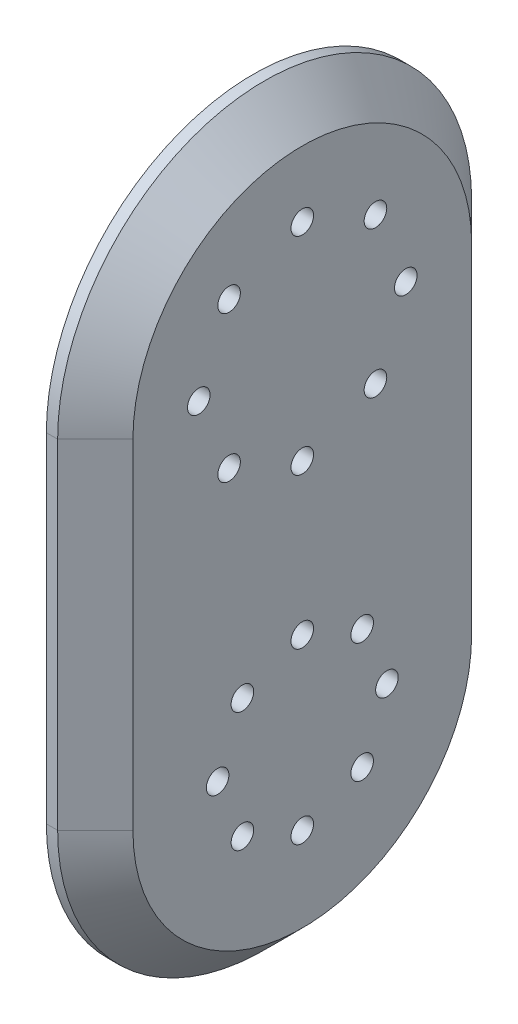
ISO-10303-21;
HEADER;
FILE_DESCRIPTION(('STEP AP214'),'2;1');
FILE_NAME('part.step','',(''),(''),'','','');
FILE_SCHEMA(('AUTOMOTIVE_DESIGN { 1 0 10303 214 1 1 1 1 }'));
ENDSEC;
DATA;
#1=APPLICATION_CONTEXT('core data for automotive mechanical design processes');
#2=APPLICATION_PROTOCOL_DEFINITION('international standard','automotive_design',2000,#1);
#3=PRODUCT_CONTEXT('',#1,'mechanical');
#4=PRODUCT('Part','Part','',(#3));
#5=PRODUCT_RELATED_PRODUCT_CATEGORY('part','',(#4));
#6=PRODUCT_DEFINITION_FORMATION('','',#4);
#7=PRODUCT_DEFINITION_CONTEXT('part definition',#1,'design');
#8=PRODUCT_DEFINITION('design','',#6,#7);
#9=PRODUCT_DEFINITION_SHAPE('','',#8);
#10=(LENGTH_UNIT() NAMED_UNIT(*) SI_UNIT(.MILLI.,.METRE.));
#11=(NAMED_UNIT(*) PLANE_ANGLE_UNIT() SI_UNIT($,.RADIAN.));
#12=(NAMED_UNIT(*) SI_UNIT($,.STERADIAN.) SOLID_ANGLE_UNIT());
#13=UNCERTAINTY_MEASURE_WITH_UNIT(LENGTH_MEASURE(1.E-05),#10,'distance_accuracy_value','');
#14=(GEOMETRIC_REPRESENTATION_CONTEXT(3) GLOBAL_UNCERTAINTY_ASSIGNED_CONTEXT((#13)) GLOBAL_UNIT_ASSIGNED_CONTEXT((#10,
#11,#12)) REPRESENTATION_CONTEXT('',''));
#15=CARTESIAN_POINT('',(0.,0.,0.));
#16=DIRECTION('',(0.,0.,1.));
#17=DIRECTION('',(1.,0.,0.));
#18=AXIS2_PLACEMENT_3D('',#15,#16,#17);
#19=CARTESIAN_POINT('',(13.,-45.,0.));
#20=DIRECTION('',(-1.,0.,0.));
#21=DIRECTION('',(0.,0.,1.));
#22=AXIS2_PLACEMENT_3D('',#19,#20,#21);
#23=CYLINDRICAL_SURFACE('',#22,55.);
#24=DIRECTION('',(-1.,0.,0.));
#25=VECTOR('',#24,1.);
#26=CARTESIAN_POINT('',(13.,-45.,-55.));
#27=LINE('',#26,#25);
#28=CARTESIAN_POINT('',(3.0000000000001,-45.,-55.));
#29=VERTEX_POINT('',#28);
#30=CARTESIAN_POINT('',(0.,-45.,-55.));
#31=VERTEX_POINT('',#30);
#32=EDGE_CURVE('E258',#29,#31,#27,.T.);
#33=ORIENTED_EDGE('',*,*,#32,.F.);
#34=CARTESIAN_POINT('',(3.00000000000009,-45.,0.));
#35=DIRECTION('',(1.,0.,0.));
#36=DIRECTION('',(0.,0.,-1.));
#37=AXIS2_PLACEMENT_3D('',#34,#35,#36);
#38=CIRCLE('',#37,55.);
#39=CARTESIAN_POINT('',(3.0000000000001,-45.,55.));
#40=VERTEX_POINT('',#39);
#41=EDGE_CURVE('E11',#29,#40,#38,.F.);
#42=ORIENTED_EDGE('',*,*,#41,.T.);
#43=DIRECTION('',(-1.,0.,0.));
#44=VECTOR('',#43,1.);
#45=CARTESIAN_POINT('',(13.,-45.,55.));
#46=LINE('',#45,#44);
#47=CARTESIAN_POINT('',(0.,-45.,55.));
#48=VERTEX_POINT('',#47);
#49=EDGE_CURVE('E252',#40,#48,#46,.T.);
#50=ORIENTED_EDGE('',*,*,#49,.T.);
#51=CARTESIAN_POINT('',(0.,-45.,0.));
#52=DIRECTION('',(1.,0.,0.));
#53=DIRECTION('',(0.,0.,-1.));
#54=AXIS2_PLACEMENT_3D('',#51,#52,#53);
#55=CIRCLE('',#54,55.);
#56=EDGE_CURVE('E240',#48,#31,#55,.T.);
#57=ORIENTED_EDGE('',*,*,#56,.T.);
#58=EDGE_LOOP('',(#33,#42,#50,#57));
#59=FACE_BOUND('',#58,.T.);
#60=ADVANCED_FACE('F37',(#59),#23,.T.);
#61=CARTESIAN_POINT('',(13.,-45.,-55.));
#62=DIRECTION('',(0.,0.,1.));
#63=DIRECTION('',(0.,-1.,0.));
#64=AXIS2_PLACEMENT_3D('',#61,#62,#63);
#65=PLANE('',#64);
#66=DIRECTION('',(-1.,0.,0.));
#67=VECTOR('',#66,1.);
#68=CARTESIAN_POINT('',(13.,45.,-55.));
#69=LINE('',#68,#67);
#70=CARTESIAN_POINT('',(3.0000000000001,45.,-55.));
#71=VERTEX_POINT('',#70);
#72=CARTESIAN_POINT('',(0.,45.,-55.));
#73=VERTEX_POINT('',#72);
#74=EDGE_CURVE('E256',#71,#73,#69,.T.);
#75=ORIENTED_EDGE('',*,*,#74,.F.);
#76=DIRECTION('',(0.,-1.,0.));
#77=VECTOR('',#76,1.);
#78=CARTESIAN_POINT('',(3.00000000000009,-45.,-55.));
#79=LINE('',#78,#77);
#80=EDGE_CURVE('E47',#71,#29,#79,.T.);
#81=ORIENTED_EDGE('',*,*,#80,.T.);
#82=ORIENTED_EDGE('',*,*,#32,.T.);
#83=DIRECTION('',(0.,1.,0.));
#84=VECTOR('',#83,1.);
#85=CARTESIAN_POINT('',(0.,-45.,-55.));
#86=LINE('',#85,#84);
#87=EDGE_CURVE('E243',#31,#73,#86,.T.);
#88=ORIENTED_EDGE('',*,*,#87,.T.);
#89=EDGE_LOOP('',(#75,#81,#82,#88));
#90=FACE_BOUND('',#89,.T.);
#91=ADVANCED_FACE('F303',(#90),#65,.F.);
#92=CARTESIAN_POINT('',(13.,45.,0.));
#93=DIRECTION('',(-1.,0.,0.));
#94=DIRECTION('',(0.,0.,1.));
#95=AXIS2_PLACEMENT_3D('',#92,#93,#94);
#96=CYLINDRICAL_SURFACE('',#95,55.);
#97=DIRECTION('',(-1.,0.,0.));
#98=VECTOR('',#97,1.);
#99=CARTESIAN_POINT('',(13.,45.,55.));
#100=LINE('',#99,#98);
#101=CARTESIAN_POINT('',(3.0000000000001,45.,55.));
#102=VERTEX_POINT('',#101);
#103=CARTESIAN_POINT('',(0.,45.,55.));
#104=VERTEX_POINT('',#103);
#105=EDGE_CURVE('E254',#102,#104,#100,.T.);
#106=ORIENTED_EDGE('',*,*,#105,.F.);
#107=CARTESIAN_POINT('',(3.00000000000009,45.,0.));
#108=DIRECTION('',(1.,0.,0.));
#109=DIRECTION('',(0.,0.,-1.));
#110=AXIS2_PLACEMENT_3D('',#107,#108,#109);
#111=CIRCLE('',#110,55.);
#112=EDGE_CURVE('E269',#102,#71,#111,.F.);
#113=ORIENTED_EDGE('',*,*,#112,.T.);
#114=ORIENTED_EDGE('',*,*,#74,.T.);
#115=CARTESIAN_POINT('',(0.,45.,0.));
#116=DIRECTION('',(1.,0.,0.));
#117=DIRECTION('',(0.,0.,-1.));
#118=AXIS2_PLACEMENT_3D('',#115,#116,#117);
#119=CIRCLE('',#118,55.);
#120=EDGE_CURVE('E246',#73,#104,#119,.T.);
#121=ORIENTED_EDGE('',*,*,#120,.T.);
#122=EDGE_LOOP('',(#106,#113,#114,#121));
#123=FACE_BOUND('',#122,.T.);
#124=ADVANCED_FACE('F305',(#123),#96,.T.);
#125=CARTESIAN_POINT('',(13.,-45.,55.));
#126=DIRECTION('',(0.,0.,-1.));
#127=DIRECTION('',(0.,1.,0.));
#128=AXIS2_PLACEMENT_3D('',#125,#126,#127);
#129=PLANE('',#128);
#130=ORIENTED_EDGE('',*,*,#49,.F.);
#131=DIRECTION('',(0.,1.,0.));
#132=VECTOR('',#131,1.);
#133=CARTESIAN_POINT('',(3.00000000000009,45.,55.));
#134=LINE('',#133,#132);
#135=EDGE_CURVE('E272',#40,#102,#134,.T.);
#136=ORIENTED_EDGE('',*,*,#135,.T.);
#137=ORIENTED_EDGE('',*,*,#105,.T.);
#138=DIRECTION('',(0.,-1.,0.));
#139=VECTOR('',#138,1.);
#140=CARTESIAN_POINT('',(0.,-45.,55.));
#141=LINE('',#140,#139);
#142=EDGE_CURVE('E249',#104,#48,#141,.T.);
#143=ORIENTED_EDGE('',*,*,#142,.T.);
#144=EDGE_LOOP('',(#130,#136,#137,#143));
#145=FACE_BOUND('',#144,.T.);
#146=ADVANCED_FACE('F295',(#145),#129,.F.);
#147=CARTESIAN_POINT('',(13.,-45.,0.));
#148=DIRECTION('',(1.,0.,0.));
#149=DIRECTION('',(0.,0.,-1.));
#150=AXIS2_PLACEMENT_3D('',#147,#148,#149);
#151=PLANE('',#150);
#152=CARTESIAN_POINT('',(13.,-22.5,0.));
#153=DIRECTION('',(1.,0.,0.));
#154=DIRECTION('',(0.,0.,-1.));
#155=AXIS2_PLACEMENT_3D('',#152,#153,#154);
#156=CIRCLE('',#155,3.);
#157=CARTESIAN_POINT('',(13.,-22.5,-3.));
#158=VERTEX_POINT('',#157);
#159=EDGE_CURVE('E155',#158,#158,#156,.T.);
#160=ORIENTED_EDGE('',*,*,#159,.F.);
#161=EDGE_LOOP('',(#160));
#162=FACE_BOUND('',#161,.T.);
#163=CARTESIAN_POINT('',(13.,-29.0900974233027,15.9099025766973));
#164=DIRECTION('',(1.,0.,0.));
#165=DIRECTION('',(0.,0.,-1.));
#166=AXIS2_PLACEMENT_3D('',#163,#164,#165);
#167=CIRCLE('',#166,3.);
#168=CARTESIAN_POINT('',(13.,-29.0900974233027,12.9099025766973));
#169=VERTEX_POINT('',#168);
#170=EDGE_CURVE('E718',#169,#169,#167,.T.);
#171=ORIENTED_EDGE('',*,*,#170,.F.);
#172=EDGE_LOOP('',(#171));
#173=FACE_BOUND('',#172,.T.);
#174=CARTESIAN_POINT('',(13.,-45.,22.5));
#175=DIRECTION('',(1.,0.,0.));
#176=DIRECTION('',(0.,0.,-1.));
#177=AXIS2_PLACEMENT_3D('',#174,#175,#176);
#178=CIRCLE('',#177,2.99999999999999);
#179=CARTESIAN_POINT('',(13.,-45.,19.5));
#180=VERTEX_POINT('',#179);
#181=EDGE_CURVE('E716',#180,#180,#178,.T.);
#182=ORIENTED_EDGE('',*,*,#181,.F.);
#183=EDGE_LOOP('',(#182));
#184=FACE_BOUND('',#183,.T.);
#185=CARTESIAN_POINT('',(13.,-60.9099025766973,15.9099025766973));
#186=DIRECTION('',(1.,0.,0.));
#187=DIRECTION('',(0.,0.,-1.));
#188=AXIS2_PLACEMENT_3D('',#185,#186,#187);
#189=CIRCLE('',#188,2.99999999999999);
#190=CARTESIAN_POINT('',(13.,-60.9099025766973,12.9099025766973));
#191=VERTEX_POINT('',#190);
#192=EDGE_CURVE('E713',#191,#191,#189,.T.);
#193=ORIENTED_EDGE('',*,*,#192,.F.);
#194=EDGE_LOOP('',(#193));
#195=FACE_BOUND('',#194,.T.);
#196=CARTESIAN_POINT('',(13.,-67.5,0.));
#197=DIRECTION('',(1.,0.,0.));
#198=DIRECTION('',(0.,0.,-1.));
#199=AXIS2_PLACEMENT_3D('',#196,#197,#198);
#200=CIRCLE('',#199,3.);
#201=CARTESIAN_POINT('',(13.,-67.5,-3.));
#202=VERTEX_POINT('',#201);
#203=EDGE_CURVE('E710',#202,#202,#200,.T.);
#204=ORIENTED_EDGE('',*,*,#203,.F.);
#205=EDGE_LOOP('',(#204));
#206=FACE_BOUND('',#205,.T.);
#207=CARTESIAN_POINT('',(13.,-60.9099025766973,-15.9099025766973));
#208=DIRECTION('',(1.,0.,0.));
#209=DIRECTION('',(0.,0.,-1.));
#210=AXIS2_PLACEMENT_3D('',#207,#208,#209);
#211=CIRCLE('',#210,3.);
#212=CARTESIAN_POINT('',(13.,-60.9099025766973,-18.9099025766973));
#213=VERTEX_POINT('',#212);
#214=EDGE_CURVE('E707',#213,#213,#211,.T.);
#215=ORIENTED_EDGE('',*,*,#214,.F.);
#216=EDGE_LOOP('',(#215));
#217=FACE_BOUND('',#216,.T.);
#218=CARTESIAN_POINT('',(13.,-45.,-22.5));
#219=DIRECTION('',(1.,0.,0.));
#220=DIRECTION('',(0.,0.,-1.));
#221=AXIS2_PLACEMENT_3D('',#218,#219,#220);
#222=CIRCLE('',#221,3.);
#223=CARTESIAN_POINT('',(13.,-45.,-25.5));
#224=VERTEX_POINT('',#223);
#225=EDGE_CURVE('E682',#224,#224,#222,.T.);
#226=ORIENTED_EDGE('',*,*,#225,.F.);
#227=EDGE_LOOP('',(#226));
#228=FACE_BOUND('',#227,.T.);
#229=CARTESIAN_POINT('',(13.,-29.0900974233027,-15.9099025766973));
#230=DIRECTION('',(1.,0.,0.));
#231=DIRECTION('',(0.,0.,-1.));
#232=AXIS2_PLACEMENT_3D('',#229,#230,#231);
#233=CIRCLE('',#232,3.);
#234=CARTESIAN_POINT('',(13.,-29.0900974233027,-18.9099025766973));
#235=VERTEX_POINT('',#234);
#236=EDGE_CURVE('E678',#235,#235,#233,.T.);
#237=ORIENTED_EDGE('',*,*,#236,.F.);
#238=EDGE_LOOP('',(#237));
#239=FACE_BOUND('',#238,.T.);
#240=CARTESIAN_POINT('',(13.,72.5,0.));
#241=DIRECTION('',(1.,0.,0.));
#242=DIRECTION('',(0.,0.,-1.));
#243=AXIS2_PLACEMENT_3D('',#240,#241,#242);
#244=CIRCLE('',#243,3.);
#245=CARTESIAN_POINT('',(13.,72.5,-3.));
#246=VERTEX_POINT('',#245);
#247=EDGE_CURVE('E190',#246,#246,#244,.F.);
#248=ORIENTED_EDGE('',*,*,#247,.T.);
#249=EDGE_LOOP('',(#248));
#250=FACE_BOUND('',#249,.T.);
#251=CARTESIAN_POINT('',(13.,64.4454364826301,19.44543648263));
#252=DIRECTION('',(1.,0.,0.));
#253=DIRECTION('',(0.,0.,-1.));
#254=AXIS2_PLACEMENT_3D('',#251,#252,#253);
#255=CIRCLE('',#254,3.00000000000001);
#256=CARTESIAN_POINT('',(13.,64.4454364826301,16.44543648263));
#257=VERTEX_POINT('',#256);
#258=EDGE_CURVE('E196',#257,#257,#255,.F.);
#259=ORIENTED_EDGE('',*,*,#258,.T.);
#260=EDGE_LOOP('',(#259));
#261=FACE_BOUND('',#260,.T.);
#262=CARTESIAN_POINT('',(13.,45.,27.5));
#263=DIRECTION('',(1.,0.,0.));
#264=DIRECTION('',(0.,0.,-1.));
#265=AXIS2_PLACEMENT_3D('',#262,#263,#264);
#266=CIRCLE('',#265,3.);
#267=CARTESIAN_POINT('',(13.,45.,24.5));
#268=VERTEX_POINT('',#267);
#269=EDGE_CURVE('E202',#268,#268,#266,.F.);
#270=ORIENTED_EDGE('',*,*,#269,.T.);
#271=EDGE_LOOP('',(#270));
#272=FACE_BOUND('',#271,.T.);
#273=CARTESIAN_POINT('',(13.,25.55456351737,19.4454364826301));
#274=DIRECTION('',(1.,0.,0.));
#275=DIRECTION('',(0.,0.,-1.));
#276=AXIS2_PLACEMENT_3D('',#273,#274,#275);
#277=CIRCLE('',#276,3.00000000000001);
#278=CARTESIAN_POINT('',(13.,25.55456351737,16.4454364826301));
#279=VERTEX_POINT('',#278);
#280=EDGE_CURVE('E208',#279,#279,#277,.F.);
#281=ORIENTED_EDGE('',*,*,#280,.T.);
#282=EDGE_LOOP('',(#281));
#283=FACE_BOUND('',#282,.T.);
#284=CARTESIAN_POINT('',(13.,17.5,0.));
#285=DIRECTION('',(1.,0.,0.));
#286=DIRECTION('',(0.,0.,-1.));
#287=AXIS2_PLACEMENT_3D('',#284,#285,#286);
#288=CIRCLE('',#287,3.);
#289=CARTESIAN_POINT('',(13.,17.5,-2.99999999999997));
#290=VERTEX_POINT('',#289);
#291=EDGE_CURVE('E214',#290,#290,#288,.F.);
#292=ORIENTED_EDGE('',*,*,#291,.T.);
#293=EDGE_LOOP('',(#292));
#294=FACE_BOUND('',#293,.T.);
#295=CARTESIAN_POINT('',(13.,25.5545635173699,-19.44543648263));
#296=DIRECTION('',(1.,0.,0.));
#297=DIRECTION('',(0.,0.,-1.));
#298=AXIS2_PLACEMENT_3D('',#295,#296,#297);
#299=CIRCLE('',#298,3.00000000000001);
#300=CARTESIAN_POINT('',(13.,25.5545635173699,-22.44543648263));
#301=VERTEX_POINT('',#300);
#302=EDGE_CURVE('E220',#301,#301,#299,.F.);
#303=ORIENTED_EDGE('',*,*,#302,.T.);
#304=EDGE_LOOP('',(#303));
#305=FACE_BOUND('',#304,.T.);
#306=CARTESIAN_POINT('',(13.,45.,-27.5));
#307=DIRECTION('',(1.,0.,0.));
#308=DIRECTION('',(0.,0.,-1.));
#309=AXIS2_PLACEMENT_3D('',#306,#307,#308);
#310=CIRCLE('',#309,3.);
#311=CARTESIAN_POINT('',(13.,45.,-30.5));
#312=VERTEX_POINT('',#311);
#313=EDGE_CURVE('E226',#312,#312,#310,.F.);
#314=ORIENTED_EDGE('',*,*,#313,.T.);
#315=EDGE_LOOP('',(#314));
#316=FACE_BOUND('',#315,.T.);
#317=CARTESIAN_POINT('',(13.,64.44543648263,-19.4454364826301));
#318=DIRECTION('',(1.,0.,0.));
#319=DIRECTION('',(0.,0.,-1.));
#320=AXIS2_PLACEMENT_3D('',#317,#318,#319);
#321=CIRCLE('',#320,3.);
#322=CARTESIAN_POINT('',(13.,64.44543648263,-22.4454364826301));
#323=VERTEX_POINT('',#322);
#324=EDGE_CURVE('E178',#323,#323,#321,.F.);
#325=ORIENTED_EDGE('',*,*,#324,.T.);
#326=EDGE_LOOP('',(#325));
#327=FACE_BOUND('',#326,.T.);
#328=DIRECTION('',(0.,1.,0.));
#329=VECTOR('',#328,1.);
#330=CARTESIAN_POINT('',(13.,45.,-45.0000000000001));
#331=LINE('',#330,#329);
#332=CARTESIAN_POINT('',(13.,-45.,-45.0000000000001));
#333=VERTEX_POINT('',#332);
#334=CARTESIAN_POINT('',(13.,45.,-45.0000000000001));
#335=VERTEX_POINT('',#334);
#336=EDGE_CURVE('E262',#333,#335,#331,.T.);
#337=ORIENTED_EDGE('',*,*,#336,.T.);
#338=CARTESIAN_POINT('',(13.,45.,0.));
#339=DIRECTION('',(1.,0.,0.));
#340=DIRECTION('',(0.,0.,-1.));
#341=AXIS2_PLACEMENT_3D('',#338,#339,#340);
#342=CIRCLE('',#341,45.0000000000001);
#343=CARTESIAN_POINT('',(13.,45.,45.0000000000002));
#344=VERTEX_POINT('',#343);
#345=EDGE_CURVE('E266',#335,#344,#342,.T.);
#346=ORIENTED_EDGE('',*,*,#345,.T.);
#347=DIRECTION('',(0.,-1.,0.));
#348=VECTOR('',#347,1.);
#349=CARTESIAN_POINT('',(13.,-45.,45.0000000000001));
#350=LINE('',#349,#348);
#351=CARTESIAN_POINT('',(13.,-45.,45.0000000000001));
#352=VERTEX_POINT('',#351);
#353=EDGE_CURVE('E264',#344,#352,#350,.T.);
#354=ORIENTED_EDGE('',*,*,#353,.T.);
#355=CARTESIAN_POINT('',(13.,-45.,0.));
#356=DIRECTION('',(1.,0.,0.));
#357=DIRECTION('',(0.,0.,-1.));
#358=AXIS2_PLACEMENT_3D('',#355,#356,#357);
#359=CIRCLE('',#358,45.0000000000001);
#360=EDGE_CURVE('E260',#352,#333,#359,.T.);
#361=ORIENTED_EDGE('',*,*,#360,.T.);
#362=EDGE_LOOP('',(#337,#346,#354,#361));
#363=FACE_BOUND('',#362,.T.);
#364=ADVANCED_FACE('F313',(#162,#173,#184,#195,#206,#217,#228,#239,#250,#261,#272,#283,#294,
#305,#316,#327,#363),#151,.T.);
#365=CARTESIAN_POINT('',(0.,-45.,0.));
#366=DIRECTION('',(1.,0.,0.));
#367=DIRECTION('',(0.,0.,-1.));
#368=AXIS2_PLACEMENT_3D('',#365,#366,#367);
#369=PLANE('',#368);
#370=DIRECTION('',(0.,0.,-1.));
#371=VECTOR('',#370,1.);
#372=CARTESIAN_POINT('',(0.,-4.99999999999999,-20.9999999999999));
#373=LINE('',#372,#371);
#374=CARTESIAN_POINT('',(0.,-4.99999999999999,20.9999999999999));
#375=VERTEX_POINT('',#374);
#376=CARTESIAN_POINT('',(0.,-4.99999999999999,-20.9999999999999));
#377=VERTEX_POINT('',#376);
#378=EDGE_CURVE('E166',#375,#377,#373,.T.);
#379=ORIENTED_EDGE('',*,*,#378,.F.);
#380=CARTESIAN_POINT('',(0.,-15.,21.));
#381=DIRECTION('',(-1.,0.,0.));
#382=DIRECTION('',(0.,0.,-1.));
#383=AXIS2_PLACEMENT_3D('',#380,#381,#382);
#384=CIRCLE('',#383,10.);
#385=CARTESIAN_POINT('',(0.,-15.0000000000001,31.));
#386=VERTEX_POINT('',#385);
#387=EDGE_CURVE('E55',#386,#375,#384,.T.);
#388=ORIENTED_EDGE('',*,*,#387,.F.);
#389=DIRECTION('',(0.,1.,0.));
#390=VECTOR('',#389,1.);
#391=CARTESIAN_POINT('',(0.,-15.0000000000001,31.));
#392=LINE('',#391,#390);
#393=CARTESIAN_POINT('',(0.,-45.,31.));
#394=VERTEX_POINT('',#393);
#395=EDGE_CURVE('E149',#394,#386,#392,.T.);
#396=ORIENTED_EDGE('',*,*,#395,.F.);
#397=CARTESIAN_POINT('',(0.,-45.,0.));
#398=DIRECTION('',(-1.,0.,0.));
#399=DIRECTION('',(0.,0.,1.));
#400=AXIS2_PLACEMENT_3D('',#397,#398,#399);
#401=CIRCLE('',#400,31.);
#402=CARTESIAN_POINT('',(0.,-45.,-31.));
#403=VERTEX_POINT('',#402);
#404=EDGE_CURVE('E152',#403,#394,#401,.T.);
#405=ORIENTED_EDGE('',*,*,#404,.F.);
#406=DIRECTION('',(0.,-1.,0.));
#407=VECTOR('',#406,1.);
#408=CARTESIAN_POINT('',(0.,-45.,-31.));
#409=LINE('',#408,#407);
#410=CARTESIAN_POINT('',(0.,-15.0000000000001,-31.));
#411=VERTEX_POINT('',#410);
#412=EDGE_CURVE('E171',#411,#403,#409,.T.);
#413=ORIENTED_EDGE('',*,*,#412,.F.);
#414=CARTESIAN_POINT('',(0.,-15.,-21.));
#415=DIRECTION('',(-1.,0.,0.));
#416=DIRECTION('',(0.,0.,-1.));
#417=AXIS2_PLACEMENT_3D('',#414,#415,#416);
#418=CIRCLE('',#417,10.);
#419=EDGE_CURVE('E168',#377,#411,#418,.T.);
#420=ORIENTED_EDGE('',*,*,#419,.F.);
#421=EDGE_LOOP('',(#379,#388,#396,#405,#413,#420));
#422=FACE_BOUND('',#421,.T.);
#423=CARTESIAN_POINT('',(0.,72.5,0.));
#424=DIRECTION('',(-1.,0.,0.));
#425=DIRECTION('',(0.,0.,1.));
#426=AXIS2_PLACEMENT_3D('',#423,#424,#425);
#427=CIRCLE('',#426,3.);
#428=CARTESIAN_POINT('',(0.,72.5,3.00000000000001));
#429=VERTEX_POINT('',#428);
#430=EDGE_CURVE('E186',#429,#429,#427,.T.);
#431=ORIENTED_EDGE('',*,*,#430,.F.);
#432=EDGE_LOOP('',(#431));
#433=FACE_BOUND('',#432,.T.);
#434=CARTESIAN_POINT('',(0.,64.4454364826301,19.44543648263));
#435=DIRECTION('',(-1.,0.,0.));
#436=DIRECTION('',(0.,0.,1.));
#437=AXIS2_PLACEMENT_3D('',#434,#435,#436);
#438=CIRCLE('',#437,3.00000000000001);
#439=CARTESIAN_POINT('',(0.,64.4454364826301,22.4454364826301));
#440=VERTEX_POINT('',#439);
#441=EDGE_CURVE('E193',#440,#440,#438,.T.);
#442=ORIENTED_EDGE('',*,*,#441,.F.);
#443=EDGE_LOOP('',(#442));
#444=FACE_BOUND('',#443,.T.);
#445=CARTESIAN_POINT('',(0.,45.,27.5));
#446=DIRECTION('',(-1.,0.,0.));
#447=DIRECTION('',(0.,0.,1.));
#448=AXIS2_PLACEMENT_3D('',#445,#446,#447);
#449=CIRCLE('',#448,3.);
#450=CARTESIAN_POINT('',(0.,45.,30.5));
#451=VERTEX_POINT('',#450);
#452=EDGE_CURVE('E199',#451,#451,#449,.T.);
#453=ORIENTED_EDGE('',*,*,#452,.F.);
#454=EDGE_LOOP('',(#453));
#455=FACE_BOUND('',#454,.T.);
#456=CARTESIAN_POINT('',(0.,25.55456351737,19.4454364826301));
#457=DIRECTION('',(-1.,0.,0.));
#458=DIRECTION('',(0.,0.,1.));
#459=AXIS2_PLACEMENT_3D('',#456,#457,#458);
#460=CIRCLE('',#459,3.00000000000001);
#461=CARTESIAN_POINT('',(0.,25.55456351737,22.4454364826301));
#462=VERTEX_POINT('',#461);
#463=EDGE_CURVE('E205',#462,#462,#460,.T.);
#464=ORIENTED_EDGE('',*,*,#463,.F.);
#465=EDGE_LOOP('',(#464));
#466=FACE_BOUND('',#465,.T.);
#467=CARTESIAN_POINT('',(0.,17.5,0.));
#468=DIRECTION('',(-1.,0.,0.));
#469=DIRECTION('',(0.,0.,1.));
#470=AXIS2_PLACEMENT_3D('',#467,#468,#469);
#471=CIRCLE('',#470,3.);
#472=CARTESIAN_POINT('',(0.,17.5,3.00000000000004));
#473=VERTEX_POINT('',#472);
#474=EDGE_CURVE('E211',#473,#473,#471,.T.);
#475=ORIENTED_EDGE('',*,*,#474,.F.);
#476=EDGE_LOOP('',(#475));
#477=FACE_BOUND('',#476,.T.);
#478=CARTESIAN_POINT('',(0.,25.5545635173699,-19.44543648263));
#479=DIRECTION('',(-1.,0.,0.));
#480=DIRECTION('',(0.,0.,1.));
#481=AXIS2_PLACEMENT_3D('',#478,#479,#480);
#482=CIRCLE('',#481,3.00000000000001);
#483=CARTESIAN_POINT('',(0.,25.5545635173699,-16.44543648263));
#484=VERTEX_POINT('',#483);
#485=EDGE_CURVE('E217',#484,#484,#482,.T.);
#486=ORIENTED_EDGE('',*,*,#485,.F.);
#487=EDGE_LOOP('',(#486));
#488=FACE_BOUND('',#487,.T.);
#489=CARTESIAN_POINT('',(0.,45.,-27.5));
#490=DIRECTION('',(-1.,0.,0.));
#491=DIRECTION('',(0.,0.,1.));
#492=AXIS2_PLACEMENT_3D('',#489,#490,#491);
#493=CIRCLE('',#492,3.);
#494=CARTESIAN_POINT('',(0.,45.,-24.5));
#495=VERTEX_POINT('',#494);
#496=EDGE_CURVE('E223',#495,#495,#493,.T.);
#497=ORIENTED_EDGE('',*,*,#496,.F.);
#498=EDGE_LOOP('',(#497));
#499=FACE_BOUND('',#498,.T.);
#500=CARTESIAN_POINT('',(0.,64.44543648263,-19.4454364826301));
#501=DIRECTION('',(-1.,0.,0.));
#502=DIRECTION('',(0.,0.,1.));
#503=AXIS2_PLACEMENT_3D('',#500,#501,#502);
#504=CIRCLE('',#503,3.);
#505=CARTESIAN_POINT('',(0.,64.44543648263,-16.4454364826301));
#506=VERTEX_POINT('',#505);
#507=EDGE_CURVE('E229',#506,#506,#504,.T.);
#508=ORIENTED_EDGE('',*,*,#507,.F.);
#509=EDGE_LOOP('',(#508));
#510=FACE_BOUND('',#509,.T.);
#511=CARTESIAN_POINT('',(0.,45.,0.));
#512=DIRECTION('',(-1.,0.,0.));
#513=DIRECTION('',(0.,0.,1.));
#514=AXIS2_PLACEMENT_3D('',#511,#512,#513);
#515=CIRCLE('',#514,23.5);
#516=CARTESIAN_POINT('',(0.,45.,23.5));
#517=VERTEX_POINT('',#516);
#518=EDGE_CURVE('E189',#517,#517,#515,.T.);
#519=ORIENTED_EDGE('',*,*,#518,.F.);
#520=EDGE_LOOP('',(#519));
#521=FACE_BOUND('',#520,.T.);
#522=ORIENTED_EDGE('',*,*,#56,.F.);
#523=ORIENTED_EDGE('',*,*,#142,.F.);
#524=ORIENTED_EDGE('',*,*,#120,.F.);
#525=ORIENTED_EDGE('',*,*,#87,.F.);
#526=EDGE_LOOP('',(#522,#523,#524,#525));
#527=FACE_BOUND('',#526,.T.);
#528=ADVANCED_FACE('F302',(#422,#433,#444,#455,#466,#477,#488,#499,#510,#521,#527),#369,.F.);
#529=CARTESIAN_POINT('',(13.,-45.,0.));
#530=DIRECTION('',(-1.,0.,0.));
#531=DIRECTION('',(0.,0.,1.));
#532=AXIS2_PLACEMENT_3D('',#529,#530,#531);
#533=CONICAL_SURFACE('',#532,45.0000000000001,0.785398163397446);
#534=DIRECTION('',(0.707106781186549,0.,-0.707106781186546));
#535=VECTOR('',#534,1.);
#536=CARTESIAN_POINT('',(3.00000000000009,-45.,55.));
#537=LINE('',#536,#535);
#538=EDGE_CURVE('E277',#40,#352,#537,.T.);
#539=ORIENTED_EDGE('',*,*,#538,.F.);
#540=ORIENTED_EDGE('',*,*,#41,.F.);
#541=DIRECTION('',(-0.707106781186549,0.,-0.707106781186546));
#542=VECTOR('',#541,1.);
#543=CARTESIAN_POINT('',(13.,-45.,-45.0000000000001));
#544=LINE('',#543,#542);
#545=EDGE_CURVE('E42',#333,#29,#544,.T.);
#546=ORIENTED_EDGE('',*,*,#545,.F.);
#547=ORIENTED_EDGE('',*,*,#360,.F.);
#548=EDGE_LOOP('',(#539,#540,#546,#547));
#549=FACE_BOUND('',#548,.T.);
#550=ADVANCED_FACE('F40',(#549),#533,.T.);
#551=CARTESIAN_POINT('',(13.,-45.,-45.0000000000001));
#552=DIRECTION('',(0.707106781186546,0.,-0.707106781186549));
#553=DIRECTION('',(0.,-1.,0.));
#554=AXIS2_PLACEMENT_3D('',#551,#552,#553);
#555=PLANE('',#554);
#556=ORIENTED_EDGE('',*,*,#545,.T.);
#557=ORIENTED_EDGE('',*,*,#80,.F.);
#558=DIRECTION('',(-0.707106781186549,0.,-0.707106781186546));
#559=VECTOR('',#558,1.);
#560=CARTESIAN_POINT('',(13.,45.,-45.0000000000001));
#561=LINE('',#560,#559);
#562=EDGE_CURVE('E276',#335,#71,#561,.T.);
#563=ORIENTED_EDGE('',*,*,#562,.F.);
#564=ORIENTED_EDGE('',*,*,#336,.F.);
#565=EDGE_LOOP('',(#556,#557,#563,#564));
#566=FACE_BOUND('',#565,.T.);
#567=ADVANCED_FACE('F287',(#566),#555,.T.);
#568=CARTESIAN_POINT('',(13.,-45.,45.0000000000001));
#569=DIRECTION('',(0.707106781186546,0.,0.707106781186549));
#570=DIRECTION('',(0.,1.,0.));
#571=AXIS2_PLACEMENT_3D('',#568,#569,#570);
#572=PLANE('',#571);
#573=ORIENTED_EDGE('',*,*,#538,.T.);
#574=ORIENTED_EDGE('',*,*,#353,.F.);
#575=DIRECTION('',(0.707106781186549,0.,-0.707106781186546));
#576=VECTOR('',#575,1.);
#577=CARTESIAN_POINT('',(3.00000000000009,45.,55.));
#578=LINE('',#577,#576);
#579=EDGE_CURVE('E237',#102,#344,#578,.T.);
#580=ORIENTED_EDGE('',*,*,#579,.F.);
#581=ORIENTED_EDGE('',*,*,#135,.F.);
#582=EDGE_LOOP('',(#573,#574,#580,#581));
#583=FACE_BOUND('',#582,.T.);
#584=ADVANCED_FACE('F311',(#583),#572,.T.);
#585=CARTESIAN_POINT('',(13.,45.,0.));
#586=DIRECTION('',(-1.,0.,0.));
#587=DIRECTION('',(0.,0.,1.));
#588=AXIS2_PLACEMENT_3D('',#585,#586,#587);
#589=CONICAL_SURFACE('',#588,45.0000000000001,0.785398163397446);
#590=ORIENTED_EDGE('',*,*,#562,.T.);
#591=ORIENTED_EDGE('',*,*,#112,.F.);
#592=ORIENTED_EDGE('',*,*,#579,.T.);
#593=ORIENTED_EDGE('',*,*,#345,.F.);
#594=EDGE_LOOP('',(#590,#591,#592,#593));
#595=FACE_BOUND('',#594,.T.);
#596=ADVANCED_FACE('F309',(#595),#589,.T.);
#597=CARTESIAN_POINT('',(10.,45.,0.));
#598=DIRECTION('',(-1.,0.,0.));
#599=DIRECTION('',(0.,0.,1.));
#600=AXIS2_PLACEMENT_3D('',#597,#598,#599);
#601=CYLINDRICAL_SURFACE('',#600,23.5);
#602=CARTESIAN_POINT('',(10.,45.,0.));
#603=DIRECTION('',(-1.,0.,0.));
#604=DIRECTION('',(0.,0.,1.));
#605=AXIS2_PLACEMENT_3D('',#602,#603,#604);
#606=CIRCLE('',#605,23.5);
#607=CARTESIAN_POINT('',(10.,45.,23.5));
#608=VERTEX_POINT('',#607);
#609=EDGE_CURVE('E234',#608,#608,#606,.T.);
#610=ORIENTED_EDGE('',*,*,#609,.F.);
#611=EDGE_LOOP('',(#610));
#612=FACE_BOUND('',#611,.T.);
#613=ORIENTED_EDGE('',*,*,#518,.T.);
#614=EDGE_LOOP('',(#613));
#615=FACE_BOUND('',#614,.T.);
#616=ADVANCED_FACE('F341',(#612,#615),#601,.F.);
#617=CARTESIAN_POINT('',(10.,45.,0.));
#618=DIRECTION('',(-1.,0.,0.));
#619=DIRECTION('',(0.,0.,1.));
#620=AXIS2_PLACEMENT_3D('',#617,#618,#619);
#621=PLANE('',#620);
#622=ORIENTED_EDGE('',*,*,#609,.T.);
#623=EDGE_LOOP('',(#622));
#624=FACE_BOUND('',#623,.T.);
#625=ADVANCED_FACE('F551',(#624),#621,.T.);
#626=CARTESIAN_POINT('',(13.001,64.44543648263,-19.4454364826301));
#627=DIRECTION('',(-1.,0.,0.));
#628=DIRECTION('',(0.,0.,1.));
#629=AXIS2_PLACEMENT_3D('',#626,#627,#628);
#630=CYLINDRICAL_SURFACE('',#629,3.);
#631=ORIENTED_EDGE('',*,*,#324,.F.);
#632=EDGE_LOOP('',(#631));
#633=FACE_BOUND('',#632,.T.);
#634=ORIENTED_EDGE('',*,*,#507,.T.);
#635=EDGE_LOOP('',(#634));
#636=FACE_BOUND('',#635,.T.);
#637=ADVANCED_FACE('F547',(#633,#636),#630,.F.);
#638=CARTESIAN_POINT('',(13.001,45.,-27.5));
#639=DIRECTION('',(-1.,0.,0.));
#640=DIRECTION('',(0.,0.,1.));
#641=AXIS2_PLACEMENT_3D('',#638,#639,#640);
#642=CYLINDRICAL_SURFACE('',#641,3.);
#643=ORIENTED_EDGE('',*,*,#313,.F.);
#644=EDGE_LOOP('',(#643));
#645=FACE_BOUND('',#644,.T.);
#646=ORIENTED_EDGE('',*,*,#496,.T.);
#647=EDGE_LOOP('',(#646));
#648=FACE_BOUND('',#647,.T.);
#649=ADVANCED_FACE('F543',(#645,#648),#642,.F.);
#650=CARTESIAN_POINT('',(13.001,25.5545635173699,-19.44543648263));
#651=DIRECTION('',(-1.,0.,0.));
#652=DIRECTION('',(0.,0.,1.));
#653=AXIS2_PLACEMENT_3D('',#650,#651,#652);
#654=CYLINDRICAL_SURFACE('',#653,3.00000000000001);
#655=ORIENTED_EDGE('',*,*,#302,.F.);
#656=EDGE_LOOP('',(#655));
#657=FACE_BOUND('',#656,.T.);
#658=ORIENTED_EDGE('',*,*,#485,.T.);
#659=EDGE_LOOP('',(#658));
#660=FACE_BOUND('',#659,.T.);
#661=ADVANCED_FACE('F539',(#657,#660),#654,.F.);
#662=CARTESIAN_POINT('',(13.001,17.5,0.));
#663=DIRECTION('',(-1.,0.,0.));
#664=DIRECTION('',(0.,0.,1.));
#665=AXIS2_PLACEMENT_3D('',#662,#663,#664);
#666=CYLINDRICAL_SURFACE('',#665,3.);
#667=ORIENTED_EDGE('',*,*,#291,.F.);
#668=EDGE_LOOP('',(#667));
#669=FACE_BOUND('',#668,.T.);
#670=ORIENTED_EDGE('',*,*,#474,.T.);
#671=EDGE_LOOP('',(#670));
#672=FACE_BOUND('',#671,.T.);
#673=ADVANCED_FACE('F535',(#669,#672),#666,.F.);
#674=CARTESIAN_POINT('',(13.001,25.55456351737,19.4454364826301));
#675=DIRECTION('',(-1.,0.,0.));
#676=DIRECTION('',(0.,0.,1.));
#677=AXIS2_PLACEMENT_3D('',#674,#675,#676);
#678=CYLINDRICAL_SURFACE('',#677,3.00000000000001);
#679=ORIENTED_EDGE('',*,*,#280,.F.);
#680=EDGE_LOOP('',(#679));
#681=FACE_BOUND('',#680,.T.);
#682=ORIENTED_EDGE('',*,*,#463,.T.);
#683=EDGE_LOOP('',(#682));
#684=FACE_BOUND('',#683,.T.);
#685=ADVANCED_FACE('F531',(#681,#684),#678,.F.);
#686=CARTESIAN_POINT('',(13.001,45.,27.5));
#687=DIRECTION('',(-1.,0.,0.));
#688=DIRECTION('',(0.,0.,1.));
#689=AXIS2_PLACEMENT_3D('',#686,#687,#688);
#690=CYLINDRICAL_SURFACE('',#689,3.);
#691=ORIENTED_EDGE('',*,*,#269,.F.);
#692=EDGE_LOOP('',(#691));
#693=FACE_BOUND('',#692,.T.);
#694=ORIENTED_EDGE('',*,*,#452,.T.);
#695=EDGE_LOOP('',(#694));
#696=FACE_BOUND('',#695,.T.);
#697=ADVANCED_FACE('F527',(#693,#696),#690,.F.);
#698=CARTESIAN_POINT('',(13.001,64.4454364826301,19.44543648263));
#699=DIRECTION('',(-1.,0.,0.));
#700=DIRECTION('',(0.,0.,1.));
#701=AXIS2_PLACEMENT_3D('',#698,#699,#700);
#702=CYLINDRICAL_SURFACE('',#701,3.00000000000001);
#703=ORIENTED_EDGE('',*,*,#258,.F.);
#704=EDGE_LOOP('',(#703));
#705=FACE_BOUND('',#704,.T.);
#706=ORIENTED_EDGE('',*,*,#441,.T.);
#707=EDGE_LOOP('',(#706));
#708=FACE_BOUND('',#707,.T.);
#709=ADVANCED_FACE('F523',(#705,#708),#702,.F.);
#710=CARTESIAN_POINT('',(13.001,72.5,0.));
#711=DIRECTION('',(-1.,0.,0.));
#712=DIRECTION('',(0.,0.,1.));
#713=AXIS2_PLACEMENT_3D('',#710,#711,#712);
#714=CYLINDRICAL_SURFACE('',#713,3.);
#715=ORIENTED_EDGE('',*,*,#247,.F.);
#716=EDGE_LOOP('',(#715));
#717=FACE_BOUND('',#716,.T.);
#718=ORIENTED_EDGE('',*,*,#430,.T.);
#719=EDGE_LOOP('',(#718));
#720=FACE_BOUND('',#719,.T.);
#721=ADVANCED_FACE('F366',(#717,#720),#714,.F.);
#722=CARTESIAN_POINT('',(7.,-15.,21.));
#723=DIRECTION('',(-1.,0.,0.));
#724=DIRECTION('',(0.,0.,1.));
#725=AXIS2_PLACEMENT_3D('',#722,#723,#724);
#726=CYLINDRICAL_SURFACE('',#725,10.);
#727=ORIENTED_EDGE('',*,*,#387,.T.);
#728=DIRECTION('',(-1.,0.,0.));
#729=VECTOR('',#728,1.);
#730=CARTESIAN_POINT('',(7.,-4.99999999999999,20.9999999999999));
#731=LINE('',#730,#729);
#732=CARTESIAN_POINT('',(7.,-4.99999999999999,20.9999999999999));
#733=VERTEX_POINT('',#732);
#734=EDGE_CURVE('E126',#733,#375,#731,.T.);
#735=ORIENTED_EDGE('',*,*,#734,.F.);
#736=CARTESIAN_POINT('',(7.,-15.,21.));
#737=DIRECTION('',(-1.,0.,0.));
#738=DIRECTION('',(0.,0.,-1.));
#739=AXIS2_PLACEMENT_3D('',#736,#737,#738);
#740=CIRCLE('',#739,10.);
#741=CARTESIAN_POINT('',(7.,-15.0000000000001,31.));
#742=VERTEX_POINT('',#741);
#743=EDGE_CURVE('E130',#742,#733,#740,.T.);
#744=ORIENTED_EDGE('',*,*,#743,.F.);
#745=DIRECTION('',(-1.,0.,0.));
#746=VECTOR('',#745,1.);
#747=CARTESIAN_POINT('',(7.,-15.0000000000001,31.));
#748=LINE('',#747,#746);
#749=EDGE_CURVE('E176',#742,#386,#748,.T.);
#750=ORIENTED_EDGE('',*,*,#749,.T.);
#751=EDGE_LOOP('',(#727,#735,#744,#750));
#752=FACE_BOUND('',#751,.T.);
#753=ADVANCED_FACE('F128',(#752),#726,.F.);
#754=CARTESIAN_POINT('',(7.,-15.0000000000001,31.));
#755=DIRECTION('',(0.,0.,1.));
#756=DIRECTION('',(1.,0.,0.));
#757=AXIS2_PLACEMENT_3D('',#754,#755,#756);
#758=PLANE('',#757);
#759=ORIENTED_EDGE('',*,*,#395,.T.);
#760=ORIENTED_EDGE('',*,*,#749,.F.);
#761=DIRECTION('',(0.,1.,0.));
#762=VECTOR('',#761,1.);
#763=CARTESIAN_POINT('',(7.,-15.0000000000001,31.));
#764=LINE('',#763,#762);
#765=CARTESIAN_POINT('',(7.,-45.,31.));
#766=VERTEX_POINT('',#765);
#767=EDGE_CURVE('E136',#766,#742,#764,.T.);
#768=ORIENTED_EDGE('',*,*,#767,.F.);
#769=DIRECTION('',(-1.,0.,0.));
#770=VECTOR('',#769,1.);
#771=CARTESIAN_POINT('',(7.,-45.,31.));
#772=LINE('',#771,#770);
#773=EDGE_CURVE('E179',#766,#394,#772,.T.);
#774=ORIENTED_EDGE('',*,*,#773,.T.);
#775=EDGE_LOOP('',(#759,#760,#768,#774));
#776=FACE_BOUND('',#775,.T.);
#777=ADVANCED_FACE('F375',(#776),#758,.F.);
#778=CARTESIAN_POINT('',(7.,-45.,0.));
#779=DIRECTION('',(-1.,0.,0.));
#780=DIRECTION('',(0.,0.,1.));
#781=AXIS2_PLACEMENT_3D('',#778,#779,#780);
#782=CYLINDRICAL_SURFACE('',#781,31.);
#783=ORIENTED_EDGE('',*,*,#404,.T.);
#784=ORIENTED_EDGE('',*,*,#773,.F.);
#785=CARTESIAN_POINT('',(7.,-45.,0.));
#786=DIRECTION('',(-1.,0.,0.));
#787=DIRECTION('',(0.,0.,1.));
#788=AXIS2_PLACEMENT_3D('',#785,#786,#787);
#789=CIRCLE('',#788,31.);
#790=CARTESIAN_POINT('',(7.,-45.,-31.));
#791=VERTEX_POINT('',#790);
#792=EDGE_CURVE('E162',#791,#766,#789,.T.);
#793=ORIENTED_EDGE('',*,*,#792,.F.);
#794=DIRECTION('',(-1.,0.,0.));
#795=VECTOR('',#794,1.);
#796=CARTESIAN_POINT('',(7.,-45.,-31.));
#797=LINE('',#796,#795);
#798=EDGE_CURVE('E181',#791,#403,#797,.T.);
#799=ORIENTED_EDGE('',*,*,#798,.T.);
#800=EDGE_LOOP('',(#783,#784,#793,#799));
#801=FACE_BOUND('',#800,.T.);
#802=ADVANCED_FACE('F384',(#801),#782,.F.);
#803=CARTESIAN_POINT('',(7.,-45.,-31.));
#804=DIRECTION('',(0.,0.,-1.));
#805=DIRECTION('',(-1.,0.,0.));
#806=AXIS2_PLACEMENT_3D('',#803,#804,#805);
#807=PLANE('',#806);
#808=ORIENTED_EDGE('',*,*,#412,.T.);
#809=ORIENTED_EDGE('',*,*,#798,.F.);
#810=DIRECTION('',(0.,-1.,0.));
#811=VECTOR('',#810,1.);
#812=CARTESIAN_POINT('',(7.,-45.,-31.));
#813=LINE('',#812,#811);
#814=CARTESIAN_POINT('',(7.,-15.0000000000001,-31.));
#815=VERTEX_POINT('',#814);
#816=EDGE_CURVE('E159',#815,#791,#813,.T.);
#817=ORIENTED_EDGE('',*,*,#816,.F.);
#818=DIRECTION('',(-1.,0.,0.));
#819=VECTOR('',#818,1.);
#820=CARTESIAN_POINT('',(7.,-15.0000000000001,-31.));
#821=LINE('',#820,#819);
#822=EDGE_CURVE('E183',#815,#411,#821,.T.);
#823=ORIENTED_EDGE('',*,*,#822,.T.);
#824=EDGE_LOOP('',(#808,#809,#817,#823));
#825=FACE_BOUND('',#824,.T.);
#826=ADVANCED_FACE('F394',(#825),#807,.F.);
#827=CARTESIAN_POINT('',(7.,-15.,-21.));
#828=DIRECTION('',(-1.,0.,0.));
#829=DIRECTION('',(0.,0.,1.));
#830=AXIS2_PLACEMENT_3D('',#827,#828,#829);
#831=CYLINDRICAL_SURFACE('',#830,10.);
#832=ORIENTED_EDGE('',*,*,#419,.T.);
#833=ORIENTED_EDGE('',*,*,#822,.F.);
#834=CARTESIAN_POINT('',(7.,-15.,-21.));
#835=DIRECTION('',(-1.,0.,0.));
#836=DIRECTION('',(0.,0.,-1.));
#837=AXIS2_PLACEMENT_3D('',#834,#835,#836);
#838=CIRCLE('',#837,10.);
#839=CARTESIAN_POINT('',(7.,-4.99999999999999,-20.9999999999999));
#840=VERTEX_POINT('',#839);
#841=EDGE_CURVE('E144',#840,#815,#838,.T.);
#842=ORIENTED_EDGE('',*,*,#841,.F.);
#843=DIRECTION('',(-1.,0.,0.));
#844=VECTOR('',#843,1.);
#845=CARTESIAN_POINT('',(7.,-4.99999999999999,-20.9999999999999));
#846=LINE('',#845,#844);
#847=EDGE_CURVE('E135',#840,#377,#846,.T.);
#848=ORIENTED_EDGE('',*,*,#847,.T.);
#849=EDGE_LOOP('',(#832,#833,#842,#848));
#850=FACE_BOUND('',#849,.T.);
#851=ADVANCED_FACE('F404',(#850),#831,.F.);
#852=CARTESIAN_POINT('',(7.,-4.99999999999999,-20.9999999999999));
#853=DIRECTION('',(0.,1.,0.));
#854=DIRECTION('',(0.,0.,1.));
#855=AXIS2_PLACEMENT_3D('',#852,#853,#854);
#856=PLANE('',#855);
#857=ORIENTED_EDGE('',*,*,#378,.T.);
#858=ORIENTED_EDGE('',*,*,#847,.F.);
#859=DIRECTION('',(0.,0.,-1.));
#860=VECTOR('',#859,1.);
#861=CARTESIAN_POINT('',(7.,-4.99999999999999,-20.9999999999999));
#862=LINE('',#861,#860);
#863=EDGE_CURVE('E139',#733,#840,#862,.T.);
#864=ORIENTED_EDGE('',*,*,#863,.F.);
#865=ORIENTED_EDGE('',*,*,#734,.T.);
#866=EDGE_LOOP('',(#857,#858,#864,#865));
#867=FACE_BOUND('',#866,.T.);
#868=ADVANCED_FACE('F140',(#867),#856,.F.);
#869=CARTESIAN_POINT('',(7.,-15.,21.));
#870=DIRECTION('',(1.,0.,0.));
#871=DIRECTION('',(0.,0.,-1.));
#872=AXIS2_PLACEMENT_3D('',#869,#870,#871);
#873=PLANE('',#872);
#874=CARTESIAN_POINT('',(7.,-22.5,0.));
#875=DIRECTION('',(-1.,0.,0.));
#876=DIRECTION('',(0.,0.,1.));
#877=AXIS2_PLACEMENT_3D('',#874,#875,#876);
#878=CIRCLE('',#877,3.);
#879=CARTESIAN_POINT('',(7.,-22.5,3.));
#880=VERTEX_POINT('',#879);
#881=EDGE_CURVE('E677',#880,#880,#878,.T.);
#882=ORIENTED_EDGE('',*,*,#881,.F.);
#883=EDGE_LOOP('',(#882));
#884=FACE_BOUND('',#883,.T.);
#885=CARTESIAN_POINT('',(7.,-29.0900974233027,15.9099025766973));
#886=DIRECTION('',(-1.,0.,0.));
#887=DIRECTION('',(0.,0.,1.));
#888=AXIS2_PLACEMENT_3D('',#885,#886,#887);
#889=CIRCLE('',#888,3.);
#890=CARTESIAN_POINT('',(7.,-29.0900974233027,18.9099025766973));
#891=VERTEX_POINT('',#890);
#892=EDGE_CURVE('E679',#891,#891,#889,.T.);
#893=ORIENTED_EDGE('',*,*,#892,.F.);
#894=EDGE_LOOP('',(#893));
#895=FACE_BOUND('',#894,.T.);
#896=CARTESIAN_POINT('',(7.,-45.,22.5));
#897=DIRECTION('',(-1.,0.,0.));
#898=DIRECTION('',(0.,0.,1.));
#899=AXIS2_PLACEMENT_3D('',#896,#897,#898);
#900=CIRCLE('',#899,2.99999999999999);
#901=CARTESIAN_POINT('',(7.,-45.,25.5));
#902=VERTEX_POINT('',#901);
#903=EDGE_CURVE('E685',#902,#902,#900,.T.);
#904=ORIENTED_EDGE('',*,*,#903,.F.);
#905=EDGE_LOOP('',(#904));
#906=FACE_BOUND('',#905,.T.);
#907=CARTESIAN_POINT('',(7.,-60.9099025766973,15.9099025766973));
#908=DIRECTION('',(-1.,0.,0.));
#909=DIRECTION('',(0.,0.,1.));
#910=AXIS2_PLACEMENT_3D('',#907,#908,#909);
#911=CIRCLE('',#910,2.99999999999999);
#912=CARTESIAN_POINT('',(7.,-60.9099025766973,18.9099025766973));
#913=VERTEX_POINT('',#912);
#914=EDGE_CURVE('E690',#913,#913,#911,.T.);
#915=ORIENTED_EDGE('',*,*,#914,.F.);
#916=EDGE_LOOP('',(#915));
#917=FACE_BOUND('',#916,.T.);
#918=CARTESIAN_POINT('',(7.,-67.5,0.));
#919=DIRECTION('',(-1.,0.,0.));
#920=DIRECTION('',(0.,0.,1.));
#921=AXIS2_PLACEMENT_3D('',#918,#919,#920);
#922=CIRCLE('',#921,3.);
#923=CARTESIAN_POINT('',(7.,-67.5,3.));
#924=VERTEX_POINT('',#923);
#925=EDGE_CURVE('E693',#924,#924,#922,.T.);
#926=ORIENTED_EDGE('',*,*,#925,.F.);
#927=EDGE_LOOP('',(#926));
#928=FACE_BOUND('',#927,.T.);
#929=CARTESIAN_POINT('',(7.,-60.9099025766973,-15.9099025766973));
#930=DIRECTION('',(-1.,0.,0.));
#931=DIRECTION('',(0.,0.,1.));
#932=AXIS2_PLACEMENT_3D('',#929,#930,#931);
#933=CIRCLE('',#932,3.);
#934=CARTESIAN_POINT('',(7.,-60.9099025766973,-12.9099025766973));
#935=VERTEX_POINT('',#934);
#936=EDGE_CURVE('E696',#935,#935,#933,.T.);
#937=ORIENTED_EDGE('',*,*,#936,.F.);
#938=EDGE_LOOP('',(#937));
#939=FACE_BOUND('',#938,.T.);
#940=CARTESIAN_POINT('',(7.,-45.,-22.5));
#941=DIRECTION('',(-1.,0.,0.));
#942=DIRECTION('',(0.,0.,1.));
#943=AXIS2_PLACEMENT_3D('',#940,#941,#942);
#944=CIRCLE('',#943,3.);
#945=CARTESIAN_POINT('',(7.,-45.,-19.5));
#946=VERTEX_POINT('',#945);
#947=EDGE_CURVE('E699',#946,#946,#944,.T.);
#948=ORIENTED_EDGE('',*,*,#947,.F.);
#949=EDGE_LOOP('',(#948));
#950=FACE_BOUND('',#949,.T.);
#951=CARTESIAN_POINT('',(7.,-29.0900974233027,-15.9099025766973));
#952=DIRECTION('',(-1.,0.,0.));
#953=DIRECTION('',(0.,0.,1.));
#954=AXIS2_PLACEMENT_3D('',#951,#952,#953);
#955=CIRCLE('',#954,3.);
#956=CARTESIAN_POINT('',(7.,-29.0900974233027,-12.9099025766973));
#957=VERTEX_POINT('',#956);
#958=EDGE_CURVE('E702',#957,#957,#955,.T.);
#959=ORIENTED_EDGE('',*,*,#958,.F.);
#960=EDGE_LOOP('',(#959));
#961=FACE_BOUND('',#960,.T.);
#962=ORIENTED_EDGE('',*,*,#743,.T.);
#963=ORIENTED_EDGE('',*,*,#863,.T.);
#964=ORIENTED_EDGE('',*,*,#841,.T.);
#965=ORIENTED_EDGE('',*,*,#816,.T.);
#966=ORIENTED_EDGE('',*,*,#792,.T.);
#967=ORIENTED_EDGE('',*,*,#767,.T.);
#968=EDGE_LOOP('',(#962,#963,#964,#965,#966,#967));
#969=FACE_BOUND('',#968,.T.);
#970=ADVANCED_FACE('F146',(#884,#895,#906,#917,#928,#939,#950,#961,#969),#873,.F.);
#971=CARTESIAN_POINT('',(14.,-29.0900974233027,-15.9099025766973));
#972=DIRECTION('',(-1.,0.,0.));
#973=DIRECTION('',(0.,0.,1.));
#974=AXIS2_PLACEMENT_3D('',#971,#972,#973);
#975=CYLINDRICAL_SURFACE('',#974,3.);
#976=ORIENTED_EDGE('',*,*,#236,.T.);
#977=EDGE_LOOP('',(#976));
#978=FACE_BOUND('',#977,.T.);
#979=ORIENTED_EDGE('',*,*,#958,.T.);
#980=EDGE_LOOP('',(#979));
#981=FACE_BOUND('',#980,.T.);
#982=ADVANCED_FACE('F435',(#978,#981),#975,.F.);
#983=CARTESIAN_POINT('',(14.,-45.,-22.5));
#984=DIRECTION('',(-1.,0.,0.));
#985=DIRECTION('',(0.,0.,1.));
#986=AXIS2_PLACEMENT_3D('',#983,#984,#985);
#987=CYLINDRICAL_SURFACE('',#986,3.);
#988=ORIENTED_EDGE('',*,*,#225,.T.);
#989=EDGE_LOOP('',(#988));
#990=FACE_BOUND('',#989,.T.);
#991=ORIENTED_EDGE('',*,*,#947,.T.);
#992=EDGE_LOOP('',(#991));
#993=FACE_BOUND('',#992,.T.);
#994=ADVANCED_FACE('F445',(#990,#993),#987,.F.);
#995=CARTESIAN_POINT('',(14.,-60.9099025766973,-15.9099025766973));
#996=DIRECTION('',(-1.,0.,0.));
#997=DIRECTION('',(0.,0.,1.));
#998=AXIS2_PLACEMENT_3D('',#995,#996,#997);
#999=CYLINDRICAL_SURFACE('',#998,3.);
#1000=ORIENTED_EDGE('',*,*,#214,.T.);
#1001=EDGE_LOOP('',(#1000));
#1002=FACE_BOUND('',#1001,.T.);
#1003=ORIENTED_EDGE('',*,*,#936,.T.);
#1004=EDGE_LOOP('',(#1003));
#1005=FACE_BOUND('',#1004,.T.);
#1006=ADVANCED_FACE('F455',(#1002,#1005),#999,.F.);
#1007=CARTESIAN_POINT('',(14.,-67.5,0.));
#1008=DIRECTION('',(-1.,0.,0.));
#1009=DIRECTION('',(0.,0.,1.));
#1010=AXIS2_PLACEMENT_3D('',#1007,#1008,#1009);
#1011=CYLINDRICAL_SURFACE('',#1010,3.);
#1012=ORIENTED_EDGE('',*,*,#203,.T.);
#1013=EDGE_LOOP('',(#1012));
#1014=FACE_BOUND('',#1013,.T.);
#1015=ORIENTED_EDGE('',*,*,#925,.T.);
#1016=EDGE_LOOP('',(#1015));
#1017=FACE_BOUND('',#1016,.T.);
#1018=ADVANCED_FACE('F465',(#1014,#1017),#1011,.F.);
#1019=CARTESIAN_POINT('',(14.,-60.9099025766973,15.9099025766973));
#1020=DIRECTION('',(-1.,0.,0.));
#1021=DIRECTION('',(0.,0.,1.));
#1022=AXIS2_PLACEMENT_3D('',#1019,#1020,#1021);
#1023=CYLINDRICAL_SURFACE('',#1022,2.99999999999999);
#1024=ORIENTED_EDGE('',*,*,#192,.T.);
#1025=EDGE_LOOP('',(#1024));
#1026=FACE_BOUND('',#1025,.T.);
#1027=ORIENTED_EDGE('',*,*,#914,.T.);
#1028=EDGE_LOOP('',(#1027));
#1029=FACE_BOUND('',#1028,.T.);
#1030=ADVANCED_FACE('F475',(#1026,#1029),#1023,.F.);
#1031=CARTESIAN_POINT('',(14.,-45.,22.5));
#1032=DIRECTION('',(-1.,0.,0.));
#1033=DIRECTION('',(0.,0.,1.));
#1034=AXIS2_PLACEMENT_3D('',#1031,#1032,#1033);
#1035=CYLINDRICAL_SURFACE('',#1034,2.99999999999999);
#1036=ORIENTED_EDGE('',*,*,#181,.T.);
#1037=EDGE_LOOP('',(#1036));
#1038=FACE_BOUND('',#1037,.T.);
#1039=ORIENTED_EDGE('',*,*,#903,.T.);
#1040=EDGE_LOOP('',(#1039));
#1041=FACE_BOUND('',#1040,.T.);
#1042=ADVANCED_FACE('F485',(#1038,#1041),#1035,.F.);
#1043=CARTESIAN_POINT('',(14.,-29.0900974233027,15.9099025766973));
#1044=DIRECTION('',(-1.,0.,0.));
#1045=DIRECTION('',(0.,0.,1.));
#1046=AXIS2_PLACEMENT_3D('',#1043,#1044,#1045);
#1047=CYLINDRICAL_SURFACE('',#1046,3.);
#1048=ORIENTED_EDGE('',*,*,#170,.T.);
#1049=EDGE_LOOP('',(#1048));
#1050=FACE_BOUND('',#1049,.T.);
#1051=ORIENTED_EDGE('',*,*,#892,.T.);
#1052=EDGE_LOOP('',(#1051));
#1053=FACE_BOUND('',#1052,.T.);
#1054=ADVANCED_FACE('F495',(#1050,#1053),#1047,.F.);
#1055=CARTESIAN_POINT('',(14.,-22.5,0.));
#1056=DIRECTION('',(-1.,0.,0.));
#1057=DIRECTION('',(0.,0.,1.));
#1058=AXIS2_PLACEMENT_3D('',#1055,#1056,#1057);
#1059=CYLINDRICAL_SURFACE('',#1058,3.);
#1060=ORIENTED_EDGE('',*,*,#159,.T.);
#1061=EDGE_LOOP('',(#1060));
#1062=FACE_BOUND('',#1061,.T.);
#1063=ORIENTED_EDGE('',*,*,#881,.T.);
#1064=EDGE_LOOP('',(#1063));
#1065=FACE_BOUND('',#1064,.T.);
#1066=ADVANCED_FACE('F505',(#1062,#1065),#1059,.F.);
#1067=CLOSED_SHELL('',(#60,#91,#124,#146,#364,#528,#550,#567,#584,#596,#616,#625,#637,#649,#661,
#673,#685,#697,#709,#721,#753,#777,#802,#826,#851,#868,#970,#982,#994,#1006,#1018,#1030,#1042,
#1054,#1066));
#1068=MANIFOLD_SOLID_BREP('B2',#1067);
#1069=ADVANCED_BREP_SHAPE_REPRESENTATION('',(#18,#1068),#14);
#1070=SHAPE_DEFINITION_REPRESENTATION(#9,#1069);
ENDSEC;
END-ISO-10303-21;
